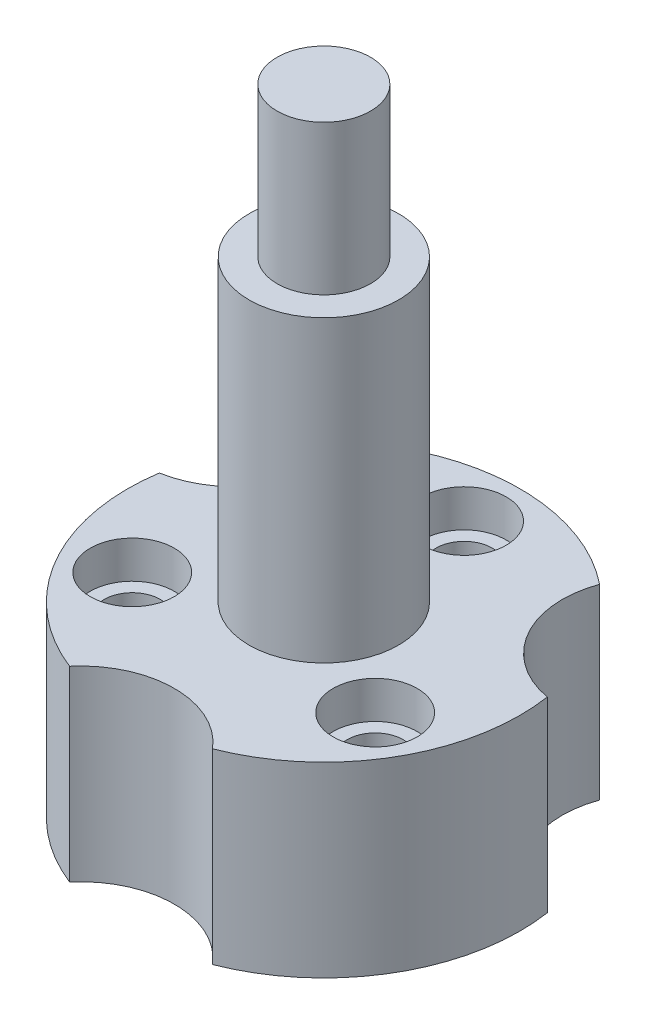
ISO-10303-21;
HEADER;
FILE_DESCRIPTION(('STEP AP214'),'2;1');
FILE_NAME('part.step','',(''),(''),'','','');
FILE_SCHEMA(('AUTOMOTIVE_DESIGN { 1 0 10303 214 1 1 1 1 }'));
ENDSEC;
DATA;
#1=APPLICATION_CONTEXT('core data for automotive mechanical design processes');
#2=APPLICATION_PROTOCOL_DEFINITION('international standard','automotive_design',2000,#1);
#3=PRODUCT_CONTEXT('',#1,'mechanical');
#4=PRODUCT('Part','Part','',(#3));
#5=PRODUCT_RELATED_PRODUCT_CATEGORY('part','',(#4));
#6=PRODUCT_DEFINITION_FORMATION('','',#4);
#7=PRODUCT_DEFINITION_CONTEXT('part definition',#1,'design');
#8=PRODUCT_DEFINITION('design','',#6,#7);
#9=PRODUCT_DEFINITION_SHAPE('','',#8);
#10=(LENGTH_UNIT() NAMED_UNIT(*) SI_UNIT(.MILLI.,.METRE.));
#11=(NAMED_UNIT(*) PLANE_ANGLE_UNIT() SI_UNIT($,.RADIAN.));
#12=(NAMED_UNIT(*) SI_UNIT($,.STERADIAN.) SOLID_ANGLE_UNIT());
#13=UNCERTAINTY_MEASURE_WITH_UNIT(LENGTH_MEASURE(1.E-05),#10,'distance_accuracy_value','');
#14=(GEOMETRIC_REPRESENTATION_CONTEXT(3) GLOBAL_UNCERTAINTY_ASSIGNED_CONTEXT((#13)) GLOBAL_UNIT_ASSIGNED_CONTEXT((#10,
#11,#12)) REPRESENTATION_CONTEXT('',''));
#15=CARTESIAN_POINT('',(0.,0.,0.));
#16=DIRECTION('',(0.,0.,1.));
#17=DIRECTION('',(1.,0.,0.));
#18=AXIS2_PLACEMENT_3D('',#15,#16,#17);
#19=CARTESIAN_POINT('',(0.,17.,0.));
#20=DIRECTION('',(0.,-1.,0.));
#21=DIRECTION('',(0.,0.,-1.));
#22=AXIS2_PLACEMENT_3D('',#19,#20,#21);
#23=CYLINDRICAL_SURFACE('',#22,4.);
#24=CARTESIAN_POINT('',(0.,10.,0.));
#25=DIRECTION('',(0.,1.,0.));
#26=DIRECTION('',(0.,0.,1.));
#27=AXIS2_PLACEMENT_3D('',#24,#25,#26);
#28=CIRCLE('',#27,4.);
#29=CARTESIAN_POINT('',(0.,10.,4.));
#30=VERTEX_POINT('',#29);
#31=EDGE_CURVE('E127',#30,#30,#28,.F.);
#32=ORIENTED_EDGE('',*,*,#31,.F.);
#33=EDGE_LOOP('',(#32));
#34=FACE_BOUND('',#33,.T.);
#35=CARTESIAN_POINT('',(0.,26.,0.));
#36=DIRECTION('',(0.,1.,0.));
#37=DIRECTION('',(0.,0.,1.));
#38=AXIS2_PLACEMENT_3D('',#35,#36,#37);
#39=CIRCLE('',#38,4.);
#40=CARTESIAN_POINT('',(0.,26.,4.));
#41=VERTEX_POINT('',#40);
#42=EDGE_CURVE('E50',#41,#41,#39,.T.);
#43=ORIENTED_EDGE('',*,*,#42,.F.);
#44=EDGE_LOOP('',(#43));
#45=FACE_BOUND('',#44,.T.);
#46=ADVANCED_FACE('F46',(#34,#45),#23,.T.);
#47=CARTESIAN_POINT('',(0.,10.,0.));
#48=DIRECTION('',(0.,-1.,0.));
#49=DIRECTION('',(0.,0.,-1.));
#50=AXIS2_PLACEMENT_3D('',#47,#48,#49);
#51=CYLINDRICAL_SURFACE('',#50,10.5);
#52=DIRECTION('',(0.,-1.,0.));
#53=VECTOR('',#52,1.);
#54=CARTESIAN_POINT('',(-3.82415584141236,16.999994,9.77884615384615));
#55=LINE('',#54,#53);
#56=CARTESIAN_POINT('',(-3.82415584141236,10.,9.77884615384616));
#57=VERTEX_POINT('',#56);
#58=CARTESIAN_POINT('',(-3.82415584141236,0.,9.77884615384615));
#59=VERTEX_POINT('',#58);
#60=EDGE_CURVE('E61',#57,#59,#55,.T.);
#61=ORIENTED_EDGE('',*,*,#60,.F.);
#62=CARTESIAN_POINT('',(0.,10.,0.));
#63=DIRECTION('',(0.,1.,0.));
#64=DIRECTION('',(0.,0.,1.));
#65=AXIS2_PLACEMENT_3D('',#62,#63,#64);
#66=CIRCLE('',#65,10.5);
#67=CARTESIAN_POINT('',(-10.3808071096367,10.,-1.5776069702295));
#68=VERTEX_POINT('',#67);
#69=EDGE_CURVE('E125',#68,#57,#66,.T.);
#70=ORIENTED_EDGE('',*,*,#69,.F.);
#71=DIRECTION('',(0.,-1.,0.));
#72=VECTOR('',#71,1.);
#73=CARTESIAN_POINT('',(-10.3808071096367,16.999994,-1.57760697022951));
#74=LINE('',#73,#72);
#75=CARTESIAN_POINT('',(-10.3808071096367,0.,-1.57760697022951));
#76=VERTEX_POINT('',#75);
#77=EDGE_CURVE('E133',#76,#68,#74,.F.);
#78=ORIENTED_EDGE('',*,*,#77,.F.);
#79=CARTESIAN_POINT('',(0.,0.,0.));
#80=DIRECTION('',(0.,1.,0.));
#81=DIRECTION('',(0.,0.,1.));
#82=AXIS2_PLACEMENT_3D('',#79,#80,#81);
#83=CIRCLE('',#82,10.5);
#84=EDGE_CURVE('E123',#76,#59,#83,.T.);
#85=ORIENTED_EDGE('',*,*,#84,.T.);
#86=EDGE_LOOP('',(#61,#70,#78,#85));
#87=FACE_BOUND('',#86,.T.);
#88=ADVANCED_FACE('F48',(#87),#51,.T.);
#89=DIRECTION('',(0.,-1.,0.));
#90=VECTOR('',#89,1.);
#91=CARTESIAN_POINT('',(3.82415584141236,16.999994,9.77884615384615));
#92=LINE('',#91,#90);
#93=CARTESIAN_POINT('',(3.82415584141236,0.,9.77884615384615));
#94=VERTEX_POINT('',#93);
#95=CARTESIAN_POINT('',(3.82415584141236,10.,9.77884615384615));
#96=VERTEX_POINT('',#95);
#97=EDGE_CURVE('E142',#94,#96,#92,.F.);
#98=ORIENTED_EDGE('',*,*,#97,.F.);
#99=CARTESIAN_POINT('',(10.3808071096367,0.,-1.57760697022907));
#100=VERTEX_POINT('',#99);
#101=EDGE_CURVE('E122',#94,#100,#83,.T.);
#102=ORIENTED_EDGE('',*,*,#101,.T.);
#103=DIRECTION('',(0.,-1.,0.));
#104=VECTOR('',#103,1.);
#105=CARTESIAN_POINT('',(10.3808071096367,16.999994,-1.57760697022907));
#106=LINE('',#105,#104);
#107=CARTESIAN_POINT('',(10.3808071096367,10.,-1.57760697022907));
#108=VERTEX_POINT('',#107);
#109=EDGE_CURVE('E104',#108,#100,#106,.T.);
#110=ORIENTED_EDGE('',*,*,#109,.F.);
#111=EDGE_CURVE('E109',#96,#108,#66,.T.);
#112=ORIENTED_EDGE('',*,*,#111,.F.);
#113=EDGE_LOOP('',(#98,#102,#110,#112));
#114=FACE_BOUND('',#113,.T.);
#115=ADVANCED_FACE('F146',(#114),#51,.T.);
#116=DIRECTION('',(0.,-1.,0.));
#117=VECTOR('',#116,1.);
#118=CARTESIAN_POINT('',(-6.55665126822418,16.999994,-8.20123918361696));
#119=LINE('',#118,#117);
#120=CARTESIAN_POINT('',(-6.55665126822419,10.,-8.20123918361696));
#121=VERTEX_POINT('',#120);
#122=CARTESIAN_POINT('',(-6.55665126822419,0.,-8.20123918361696));
#123=VERTEX_POINT('',#122);
#124=EDGE_CURVE('E69',#121,#123,#119,.T.);
#125=ORIENTED_EDGE('',*,*,#124,.F.);
#126=CARTESIAN_POINT('',(6.55665126822453,10.,-8.20123918361669));
#127=VERTEX_POINT('',#126);
#128=EDGE_CURVE('E117',#127,#121,#66,.T.);
#129=ORIENTED_EDGE('',*,*,#128,.F.);
#130=DIRECTION('',(0.,-1.,0.));
#131=VECTOR('',#130,1.);
#132=CARTESIAN_POINT('',(6.55665126822453,16.999994,-8.20123918361669));
#133=LINE('',#132,#131);
#134=CARTESIAN_POINT('',(6.55665126822453,0.,-8.20123918361669));
#135=VERTEX_POINT('',#134);
#136=EDGE_CURVE('E101',#135,#127,#133,.F.);
#137=ORIENTED_EDGE('',*,*,#136,.F.);
#138=EDGE_CURVE('E115',#135,#123,#83,.T.);
#139=ORIENTED_EDGE('',*,*,#138,.T.);
#140=EDGE_LOOP('',(#125,#129,#137,#139));
#141=FACE_BOUND('',#140,.T.);
#142=ADVANCED_FACE('F114',(#141),#51,.T.);
#143=CARTESIAN_POINT('',(0.,10.,0.));
#144=DIRECTION('',(0.,1.,0.));
#145=DIRECTION('',(0.,0.,1.));
#146=AXIS2_PLACEMENT_3D('',#143,#144,#145);
#147=PLANE('',#146);
#148=CARTESIAN_POINT('',(0.,10.,-7.50555349946514));
#149=DIRECTION('',(0.,1.,0.));
#150=DIRECTION('',(0.,0.,1.));
#151=AXIS2_PLACEMENT_3D('',#148,#149,#150);
#152=CIRCLE('',#151,2.25);
#153=CARTESIAN_POINT('',(0.,10.,-5.25555349946514));
#154=VERTEX_POINT('',#153);
#155=EDGE_CURVE('E182',#154,#154,#152,.T.);
#156=ORIENTED_EDGE('',*,*,#155,.F.);
#157=EDGE_LOOP('',(#156));
#158=FACE_BOUND('',#157,.T.);
#159=CARTESIAN_POINT('',(6.5,10.,3.75277674973257));
#160=DIRECTION('',(0.,1.,0.));
#161=DIRECTION('',(0.,0.,1.));
#162=AXIS2_PLACEMENT_3D('',#159,#160,#161);
#163=CIRCLE('',#162,2.25);
#164=CARTESIAN_POINT('',(6.5,10.,6.00277674973257));
#165=VERTEX_POINT('',#164);
#166=EDGE_CURVE('E194',#165,#165,#163,.T.);
#167=ORIENTED_EDGE('',*,*,#166,.F.);
#168=EDGE_LOOP('',(#167));
#169=FACE_BOUND('',#168,.T.);
#170=CARTESIAN_POINT('',(-6.5,10.,3.75277674973257));
#171=DIRECTION('',(0.,1.,0.));
#172=DIRECTION('',(0.,0.,1.));
#173=AXIS2_PLACEMENT_3D('',#170,#171,#172);
#174=CIRCLE('',#173,2.25);
#175=CARTESIAN_POINT('',(-6.5,10.,6.00277674973257));
#176=VERTEX_POINT('',#175);
#177=EDGE_CURVE('E206',#176,#176,#174,.T.);
#178=ORIENTED_EDGE('',*,*,#177,.F.);
#179=EDGE_LOOP('',(#178));
#180=FACE_BOUND('',#179,.T.);
#181=ORIENTED_EDGE('',*,*,#31,.T.);
#182=EDGE_LOOP('',(#181));
#183=FACE_BOUND('',#182,.T.);
#184=ORIENTED_EDGE('',*,*,#69,.T.);
#185=CARTESIAN_POINT('',(0.,10.,13.));
#186=DIRECTION('',(0.,1.,0.));
#187=DIRECTION('',(0.,0.,1.));
#188=AXIS2_PLACEMENT_3D('',#185,#186,#187);
#189=CIRCLE('',#188,5.);
#190=EDGE_CURVE('E150',#57,#96,#189,.F.);
#191=ORIENTED_EDGE('',*,*,#190,.T.);
#192=ORIENTED_EDGE('',*,*,#111,.T.);
#193=CARTESIAN_POINT('',(11.2583302491979,10.,-6.49999999999974));
#194=DIRECTION('',(0.,1.,0.));
#195=DIRECTION('',(0.,0.,1.));
#196=AXIS2_PLACEMENT_3D('',#193,#194,#195);
#197=CIRCLE('',#196,5.);
#198=EDGE_CURVE('E138',#108,#127,#197,.F.);
#199=ORIENTED_EDGE('',*,*,#198,.T.);
#200=ORIENTED_EDGE('',*,*,#128,.T.);
#201=CARTESIAN_POINT('',(-11.2583302491976,10.,-6.50000000000021));
#202=DIRECTION('',(0.,1.,0.));
#203=DIRECTION('',(0.,0.,1.));
#204=AXIS2_PLACEMENT_3D('',#201,#202,#203);
#205=CIRCLE('',#204,5.);
#206=EDGE_CURVE('E148',#121,#68,#205,.F.);
#207=ORIENTED_EDGE('',*,*,#206,.T.);
#208=EDGE_LOOP('',(#184,#191,#192,#199,#200,#207));
#209=FACE_BOUND('',#208,.T.);
#210=ADVANCED_FACE('F158',(#158,#169,#180,#183,#209),#147,.T.);
#211=CARTESIAN_POINT('',(0.,0.,0.));
#212=DIRECTION('',(0.,1.,0.));
#213=DIRECTION('',(0.,0.,1.));
#214=AXIS2_PLACEMENT_3D('',#211,#212,#213);
#215=PLANE('',#214);
#216=CARTESIAN_POINT('',(0.,0.,0.));
#217=DIRECTION('',(0.,-1.,0.));
#218=DIRECTION('',(0.,0.,-1.));
#219=AXIS2_PLACEMENT_3D('',#216,#217,#218);
#220=CIRCLE('',#219,5.50000000000001);
#221=CARTESIAN_POINT('',(0.,0.,-5.50000000000001));
#222=VERTEX_POINT('',#221);
#223=EDGE_CURVE('E167',#222,#222,#220,.T.);
#224=ORIENTED_EDGE('',*,*,#223,.F.);
#225=EDGE_LOOP('',(#224));
#226=FACE_BOUND('',#225,.T.);
#227=CARTESIAN_POINT('',(0.,0.,-7.50555349946514));
#228=DIRECTION('',(0.,1.,0.));
#229=DIRECTION('',(0.,0.,1.));
#230=AXIS2_PLACEMENT_3D('',#227,#228,#229);
#231=CIRCLE('',#230,1.5);
#232=CARTESIAN_POINT('',(0.,0.,-6.00555349946514));
#233=VERTEX_POINT('',#232);
#234=EDGE_CURVE('E191',#233,#233,#231,.T.);
#235=ORIENTED_EDGE('',*,*,#234,.T.);
#236=EDGE_LOOP('',(#235));
#237=FACE_BOUND('',#236,.T.);
#238=CARTESIAN_POINT('',(6.5,0.,3.75277674973257));
#239=DIRECTION('',(0.,1.,0.));
#240=DIRECTION('',(0.,0.,1.));
#241=AXIS2_PLACEMENT_3D('',#238,#239,#240);
#242=CIRCLE('',#241,1.5);
#243=CARTESIAN_POINT('',(6.5,0.,5.25277674973257));
#244=VERTEX_POINT('',#243);
#245=EDGE_CURVE('E203',#244,#244,#242,.T.);
#246=ORIENTED_EDGE('',*,*,#245,.T.);
#247=EDGE_LOOP('',(#246));
#248=FACE_BOUND('',#247,.T.);
#249=CARTESIAN_POINT('',(-6.5,0.,3.75277674973257));
#250=DIRECTION('',(0.,1.,0.));
#251=DIRECTION('',(0.,0.,1.));
#252=AXIS2_PLACEMENT_3D('',#249,#250,#251);
#253=CIRCLE('',#252,1.5);
#254=CARTESIAN_POINT('',(-6.5,0.,5.25277674973256));
#255=VERTEX_POINT('',#254);
#256=EDGE_CURVE('E118',#255,#255,#253,.T.);
#257=ORIENTED_EDGE('',*,*,#256,.T.);
#258=EDGE_LOOP('',(#257));
#259=FACE_BOUND('',#258,.T.);
#260=CARTESIAN_POINT('',(0.,0.,13.));
#261=DIRECTION('',(0.,1.,0.));
#262=DIRECTION('',(0.,0.,1.));
#263=AXIS2_PLACEMENT_3D('',#260,#261,#262);
#264=CIRCLE('',#263,5.);
#265=EDGE_CURVE('E12',#59,#94,#264,.F.);
#266=ORIENTED_EDGE('',*,*,#265,.F.);
#267=ORIENTED_EDGE('',*,*,#84,.F.);
#268=CARTESIAN_POINT('',(-11.2583302491976,0.,-6.50000000000021));
#269=DIRECTION('',(0.,1.,0.));
#270=DIRECTION('',(0.,0.,1.));
#271=AXIS2_PLACEMENT_3D('',#268,#269,#270);
#272=CIRCLE('',#271,5.);
#273=EDGE_CURVE('E55',#123,#76,#272,.F.);
#274=ORIENTED_EDGE('',*,*,#273,.F.);
#275=ORIENTED_EDGE('',*,*,#138,.F.);
#276=CARTESIAN_POINT('',(11.2583302491979,0.,-6.49999999999974));
#277=DIRECTION('',(0.,1.,0.));
#278=DIRECTION('',(0.,0.,1.));
#279=AXIS2_PLACEMENT_3D('',#276,#277,#278);
#280=CIRCLE('',#279,5.);
#281=EDGE_CURVE('E98',#100,#135,#280,.F.);
#282=ORIENTED_EDGE('',*,*,#281,.F.);
#283=ORIENTED_EDGE('',*,*,#101,.F.);
#284=EDGE_LOOP('',(#266,#267,#274,#275,#282,#283));
#285=FACE_BOUND('',#284,.T.);
#286=ADVANCED_FACE('F120',(#226,#237,#248,#259,#285),#215,.F.);
#287=CARTESIAN_POINT('',(11.2583302491979,34.,-6.49999999999974));
#288=DIRECTION('',(0.,-1.,0.));
#289=DIRECTION('',(0.,0.,-1.));
#290=AXIS2_PLACEMENT_3D('',#287,#288,#289);
#291=CYLINDRICAL_SURFACE('',#290,5.);
#292=ORIENTED_EDGE('',*,*,#109,.T.);
#293=ORIENTED_EDGE('',*,*,#281,.T.);
#294=ORIENTED_EDGE('',*,*,#136,.T.);
#295=ORIENTED_EDGE('',*,*,#198,.F.);
#296=EDGE_LOOP('',(#292,#293,#294,#295));
#297=FACE_BOUND('',#296,.T.);
#298=ADVANCED_FACE('F100',(#297),#291,.F.);
#299=CARTESIAN_POINT('',(-11.2583302491976,34.,-6.50000000000021));
#300=DIRECTION('',(0.,-1.,0.));
#301=DIRECTION('',(0.,0.,-1.));
#302=AXIS2_PLACEMENT_3D('',#299,#300,#301);
#303=CYLINDRICAL_SURFACE('',#302,5.);
#304=ORIENTED_EDGE('',*,*,#124,.T.);
#305=ORIENTED_EDGE('',*,*,#273,.T.);
#306=ORIENTED_EDGE('',*,*,#77,.T.);
#307=ORIENTED_EDGE('',*,*,#206,.F.);
#308=EDGE_LOOP('',(#304,#305,#306,#307));
#309=FACE_BOUND('',#308,.T.);
#310=ADVANCED_FACE('F132',(#309),#303,.F.);
#311=CARTESIAN_POINT('',(0.,34.,13.));
#312=DIRECTION('',(0.,-1.,0.));
#313=DIRECTION('',(0.,0.,-1.));
#314=AXIS2_PLACEMENT_3D('',#311,#312,#313);
#315=CYLINDRICAL_SURFACE('',#314,5.);
#316=ORIENTED_EDGE('',*,*,#60,.T.);
#317=ORIENTED_EDGE('',*,*,#265,.T.);
#318=ORIENTED_EDGE('',*,*,#97,.T.);
#319=ORIENTED_EDGE('',*,*,#190,.F.);
#320=EDGE_LOOP('',(#316,#317,#318,#319));
#321=FACE_BOUND('',#320,.T.);
#322=ADVANCED_FACE('F141',(#321),#315,.F.);
#323=CARTESIAN_POINT('',(-6.5,10.,3.75277674973257));
#324=DIRECTION('',(0.,1.,0.));
#325=DIRECTION('',(0.,0.,1.));
#326=AXIS2_PLACEMENT_3D('',#323,#324,#325);
#327=CYLINDRICAL_SURFACE('',#326,1.5);
#328=ORIENTED_EDGE('',*,*,#256,.F.);
#329=EDGE_LOOP('',(#328));
#330=FACE_BOUND('',#329,.T.);
#331=CARTESIAN_POINT('',(-6.5,8.,3.75277674973257));
#332=DIRECTION('',(0.,1.,0.));
#333=DIRECTION('',(0.,0.,1.));
#334=AXIS2_PLACEMENT_3D('',#331,#332,#333);
#335=CIRCLE('',#334,1.5);
#336=CARTESIAN_POINT('',(-6.5,8.,5.25277674973256));
#337=VERTEX_POINT('',#336);
#338=EDGE_CURVE('E212',#337,#337,#335,.T.);
#339=ORIENTED_EDGE('',*,*,#338,.T.);
#340=EDGE_LOOP('',(#339));
#341=FACE_BOUND('',#340,.T.);
#342=ADVANCED_FACE('F240',(#330,#341),#327,.F.);
#343=CARTESIAN_POINT('',(-5.,8.,3.75277674973257));
#344=DIRECTION('',(0.,-1.,0.));
#345=DIRECTION('',(0.,0.,-1.));
#346=AXIS2_PLACEMENT_3D('',#343,#344,#345);
#347=PLANE('',#346);
#348=ORIENTED_EDGE('',*,*,#338,.F.);
#349=EDGE_LOOP('',(#348));
#350=FACE_BOUND('',#349,.T.);
#351=CARTESIAN_POINT('',(-6.5,8.,3.75277674973257));
#352=DIRECTION('',(0.,1.,0.));
#353=DIRECTION('',(0.,0.,1.));
#354=AXIS2_PLACEMENT_3D('',#351,#352,#353);
#355=CIRCLE('',#354,2.25);
#356=CARTESIAN_POINT('',(-6.5,8.,6.00277674973257));
#357=VERTEX_POINT('',#356);
#358=EDGE_CURVE('E209',#357,#357,#355,.T.);
#359=ORIENTED_EDGE('',*,*,#358,.T.);
#360=EDGE_LOOP('',(#359));
#361=FACE_BOUND('',#360,.T.);
#362=ADVANCED_FACE('F243',(#350,#361),#347,.F.);
#363=CARTESIAN_POINT('',(-6.5,10.,3.75277674973257));
#364=DIRECTION('',(0.,1.,0.));
#365=DIRECTION('',(0.,0.,1.));
#366=AXIS2_PLACEMENT_3D('',#363,#364,#365);
#367=CYLINDRICAL_SURFACE('',#366,2.25);
#368=ORIENTED_EDGE('',*,*,#358,.F.);
#369=EDGE_LOOP('',(#368));
#370=FACE_BOUND('',#369,.T.);
#371=ORIENTED_EDGE('',*,*,#177,.T.);
#372=EDGE_LOOP('',(#371));
#373=FACE_BOUND('',#372,.T.);
#374=ADVANCED_FACE('F247',(#370,#373),#367,.F.);
#375=CARTESIAN_POINT('',(6.5,10.,3.75277674973257));
#376=DIRECTION('',(0.,1.,0.));
#377=DIRECTION('',(0.,0.,1.));
#378=AXIS2_PLACEMENT_3D('',#375,#376,#377);
#379=CYLINDRICAL_SURFACE('',#378,1.5);
#380=ORIENTED_EDGE('',*,*,#245,.F.);
#381=EDGE_LOOP('',(#380));
#382=FACE_BOUND('',#381,.T.);
#383=CARTESIAN_POINT('',(6.5,8.,3.75277674973257));
#384=DIRECTION('',(0.,1.,0.));
#385=DIRECTION('',(0.,0.,1.));
#386=AXIS2_PLACEMENT_3D('',#383,#384,#385);
#387=CIRCLE('',#386,1.5);
#388=CARTESIAN_POINT('',(6.5,8.,5.25277674973257));
#389=VERTEX_POINT('',#388);
#390=EDGE_CURVE('E200',#389,#389,#387,.T.);
#391=ORIENTED_EDGE('',*,*,#390,.T.);
#392=EDGE_LOOP('',(#391));
#393=FACE_BOUND('',#392,.T.);
#394=ADVANCED_FACE('F251',(#382,#393),#379,.F.);
#395=CARTESIAN_POINT('',(8.,8.,3.75277674973257));
#396=DIRECTION('',(0.,-1.,0.));
#397=DIRECTION('',(0.,0.,-1.));
#398=AXIS2_PLACEMENT_3D('',#395,#396,#397);
#399=PLANE('',#398);
#400=ORIENTED_EDGE('',*,*,#390,.F.);
#401=EDGE_LOOP('',(#400));
#402=FACE_BOUND('',#401,.T.);
#403=CARTESIAN_POINT('',(6.5,8.,3.75277674973257));
#404=DIRECTION('',(0.,1.,0.));
#405=DIRECTION('',(0.,0.,1.));
#406=AXIS2_PLACEMENT_3D('',#403,#404,#405);
#407=CIRCLE('',#406,2.25);
#408=CARTESIAN_POINT('',(6.5,8.,6.00277674973257));
#409=VERTEX_POINT('',#408);
#410=EDGE_CURVE('E197',#409,#409,#407,.T.);
#411=ORIENTED_EDGE('',*,*,#410,.T.);
#412=EDGE_LOOP('',(#411));
#413=FACE_BOUND('',#412,.T.);
#414=ADVANCED_FACE('F255',(#402,#413),#399,.F.);
#415=CARTESIAN_POINT('',(6.5,10.,3.75277674973257));
#416=DIRECTION('',(0.,1.,0.));
#417=DIRECTION('',(0.,0.,1.));
#418=AXIS2_PLACEMENT_3D('',#415,#416,#417);
#419=CYLINDRICAL_SURFACE('',#418,2.25);
#420=ORIENTED_EDGE('',*,*,#410,.F.);
#421=EDGE_LOOP('',(#420));
#422=FACE_BOUND('',#421,.T.);
#423=ORIENTED_EDGE('',*,*,#166,.T.);
#424=EDGE_LOOP('',(#423));
#425=FACE_BOUND('',#424,.T.);
#426=ADVANCED_FACE('F259',(#422,#425),#419,.F.);
#427=CARTESIAN_POINT('',(0.,10.,-7.50555349946514));
#428=DIRECTION('',(0.,1.,0.));
#429=DIRECTION('',(0.,0.,1.));
#430=AXIS2_PLACEMENT_3D('',#427,#428,#429);
#431=CYLINDRICAL_SURFACE('',#430,1.5);
#432=ORIENTED_EDGE('',*,*,#234,.F.);
#433=EDGE_LOOP('',(#432));
#434=FACE_BOUND('',#433,.T.);
#435=CARTESIAN_POINT('',(0.,8.,-7.50555349946514));
#436=DIRECTION('',(0.,1.,0.));
#437=DIRECTION('',(0.,0.,1.));
#438=AXIS2_PLACEMENT_3D('',#435,#436,#437);
#439=CIRCLE('',#438,1.5);
#440=CARTESIAN_POINT('',(0.,8.,-6.00555349946514));
#441=VERTEX_POINT('',#440);
#442=EDGE_CURVE('E188',#441,#441,#439,.T.);
#443=ORIENTED_EDGE('',*,*,#442,.T.);
#444=EDGE_LOOP('',(#443));
#445=FACE_BOUND('',#444,.T.);
#446=ADVANCED_FACE('F263',(#434,#445),#431,.F.);
#447=CARTESIAN_POINT('',(1.5,8.,-7.50555349946514));
#448=DIRECTION('',(0.,-1.,0.));
#449=DIRECTION('',(0.,0.,-1.));
#450=AXIS2_PLACEMENT_3D('',#447,#448,#449);
#451=PLANE('',#450);
#452=ORIENTED_EDGE('',*,*,#442,.F.);
#453=EDGE_LOOP('',(#452));
#454=FACE_BOUND('',#453,.T.);
#455=CARTESIAN_POINT('',(0.,8.,-7.50555349946514));
#456=DIRECTION('',(0.,1.,0.));
#457=DIRECTION('',(0.,0.,1.));
#458=AXIS2_PLACEMENT_3D('',#455,#456,#457);
#459=CIRCLE('',#458,2.25);
#460=CARTESIAN_POINT('',(0.,8.,-5.25555349946514));
#461=VERTEX_POINT('',#460);
#462=EDGE_CURVE('E185',#461,#461,#459,.T.);
#463=ORIENTED_EDGE('',*,*,#462,.T.);
#464=EDGE_LOOP('',(#463));
#465=FACE_BOUND('',#464,.T.);
#466=ADVANCED_FACE('F267',(#454,#465),#451,.F.);
#467=CARTESIAN_POINT('',(0.,10.,-7.50555349946514));
#468=DIRECTION('',(0.,1.,0.));
#469=DIRECTION('',(0.,0.,1.));
#470=AXIS2_PLACEMENT_3D('',#467,#468,#469);
#471=CYLINDRICAL_SURFACE('',#470,2.25);
#472=ORIENTED_EDGE('',*,*,#462,.F.);
#473=EDGE_LOOP('',(#472));
#474=FACE_BOUND('',#473,.T.);
#475=ORIENTED_EDGE('',*,*,#155,.T.);
#476=EDGE_LOOP('',(#475));
#477=FACE_BOUND('',#476,.T.);
#478=ADVANCED_FACE('F271',(#474,#477),#471,.F.);
#479=CARTESIAN_POINT('',(0.,7.00000000000001,0.));
#480=DIRECTION('',(0.,1.,0.));
#481=DIRECTION('',(0.,0.,1.));
#482=AXIS2_PLACEMENT_3D('',#479,#480,#481);
#483=PLANE('',#482);
#484=CARTESIAN_POINT('',(0.,7.00000000000001,0.));
#485=DIRECTION('',(0.,-1.,0.));
#486=DIRECTION('',(0.,0.,-1.));
#487=AXIS2_PLACEMENT_3D('',#484,#485,#486);
#488=CIRCLE('',#487,5.50000000000001);
#489=CARTESIAN_POINT('',(0.,7.00000000000001,-5.50000000000001));
#490=VERTEX_POINT('',#489);
#491=EDGE_CURVE('E170',#490,#490,#488,.T.);
#492=ORIENTED_EDGE('',*,*,#491,.T.);
#493=EDGE_LOOP('',(#492));
#494=FACE_BOUND('',#493,.T.);
#495=ADVANCED_FACE('F275',(#494),#483,.F.);
#496=CARTESIAN_POINT('',(0.,0.,0.));
#497=DIRECTION('',(0.,-1.,0.));
#498=DIRECTION('',(0.,0.,-1.));
#499=AXIS2_PLACEMENT_3D('',#496,#497,#498);
#500=CYLINDRICAL_SURFACE('',#499,5.50000000000001);
#501=ORIENTED_EDGE('',*,*,#491,.F.);
#502=EDGE_LOOP('',(#501));
#503=FACE_BOUND('',#502,.T.);
#504=ORIENTED_EDGE('',*,*,#223,.T.);
#505=EDGE_LOOP('',(#504));
#506=FACE_BOUND('',#505,.T.);
#507=ADVANCED_FACE('F279',(#503,#506),#500,.F.);
#508=CARTESIAN_POINT('',(0.,26.,0.));
#509=DIRECTION('',(0.,1.,0.));
#510=DIRECTION('',(0.,0.,1.));
#511=AXIS2_PLACEMENT_3D('',#508,#509,#510);
#512=PLANE('',#511);
#513=CARTESIAN_POINT('',(0.,26.,0.));
#514=DIRECTION('',(0.,1.,0.));
#515=DIRECTION('',(0.,0.,1.));
#516=AXIS2_PLACEMENT_3D('',#513,#514,#515);
#517=CIRCLE('',#516,2.5);
#518=CARTESIAN_POINT('',(0.,26.,2.5));
#519=VERTEX_POINT('',#518);
#520=EDGE_CURVE('E168',#519,#519,#517,.F.);
#521=ORIENTED_EDGE('',*,*,#520,.T.);
#522=EDGE_LOOP('',(#521));
#523=FACE_BOUND('',#522,.T.);
#524=ORIENTED_EDGE('',*,*,#42,.T.);
#525=EDGE_LOOP('',(#524));
#526=FACE_BOUND('',#525,.T.);
#527=ADVANCED_FACE('F283',(#523,#526),#512,.T.);
#528=CARTESIAN_POINT('',(0.,0.483536055687302,0.));
#529=DIRECTION('',(0.,1.,0.));
#530=DIRECTION('',(0.,0.,1.));
#531=AXIS2_PLACEMENT_3D('',#528,#529,#530);
#532=CYLINDRICAL_SURFACE('',#531,2.5);
#533=ORIENTED_EDGE('',*,*,#520,.F.);
#534=EDGE_LOOP('',(#533));
#535=FACE_BOUND('',#534,.T.);
#536=CARTESIAN_POINT('',(0.,34.,0.));
#537=DIRECTION('',(0.,1.,0.));
#538=DIRECTION('',(0.,0.,1.));
#539=AXIS2_PLACEMENT_3D('',#536,#537,#538);
#540=CIRCLE('',#539,2.5);
#541=CARTESIAN_POINT('',(0.,34.,2.5));
#542=VERTEX_POINT('',#541);
#543=EDGE_CURVE('E173',#542,#542,#540,.T.);
#544=ORIENTED_EDGE('',*,*,#543,.F.);
#545=EDGE_LOOP('',(#544));
#546=FACE_BOUND('',#545,.T.);
#547=ADVANCED_FACE('F232',(#535,#546),#532,.T.);
#548=CARTESIAN_POINT('',(3.3095,34.,0.));
#549=DIRECTION('',(0.,1.,0.));
#550=DIRECTION('',(0.,0.,1.));
#551=AXIS2_PLACEMENT_3D('',#548,#549,#550);
#552=PLANE('',#551);
#553=ORIENTED_EDGE('',*,*,#543,.T.);
#554=EDGE_LOOP('',(#553));
#555=FACE_BOUND('',#554,.T.);
#556=ADVANCED_FACE('F229',(#555),#552,.T.);
#557=CLOSED_SHELL('',(#46,#88,#115,#142,#210,#286,#298,#310,#322,#342,#362,#374,#394,#414,#426,
#446,#466,#478,#495,#507,#527,#547,#556));
#558=MANIFOLD_SOLID_BREP('B2',#557);
#559=ADVANCED_BREP_SHAPE_REPRESENTATION('',(#18,#558),#14);
#560=SHAPE_DEFINITION_REPRESENTATION(#9,#559);
ENDSEC;
END-ISO-10303-21;
